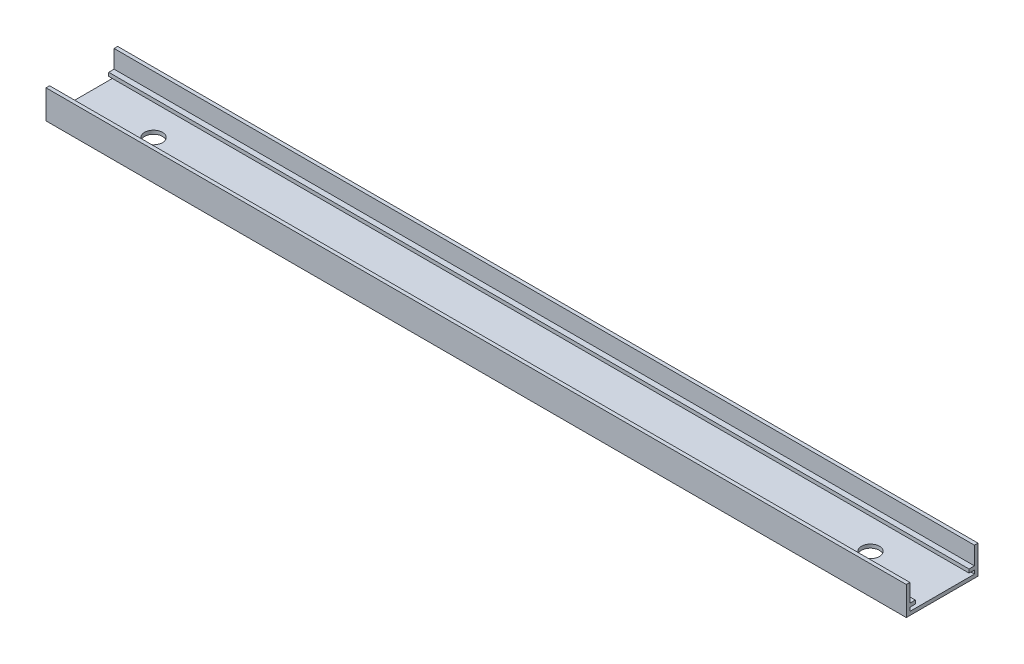
ISO-10303-21;
HEADER;
FILE_DESCRIPTION(('STEP AP214'),'2;1');
FILE_NAME('part.step','',(''),(''),'','','');
FILE_SCHEMA(('AUTOMOTIVE_DESIGN { 1 0 10303 214 1 1 1 1 }'));
ENDSEC;
DATA;
#1=APPLICATION_CONTEXT('core data for automotive mechanical design processes');
#2=APPLICATION_PROTOCOL_DEFINITION('international standard','automotive_design',2000,#1);
#3=PRODUCT_CONTEXT('',#1,'mechanical');
#4=PRODUCT('Part','Part','',(#3));
#5=PRODUCT_RELATED_PRODUCT_CATEGORY('part','',(#4));
#6=PRODUCT_DEFINITION_FORMATION('','',#4);
#7=PRODUCT_DEFINITION_CONTEXT('part definition',#1,'design');
#8=PRODUCT_DEFINITION('design','',#6,#7);
#9=PRODUCT_DEFINITION_SHAPE('','',#8);
#10=(LENGTH_UNIT() NAMED_UNIT(*) SI_UNIT(.MILLI.,.METRE.));
#11=(NAMED_UNIT(*) PLANE_ANGLE_UNIT() SI_UNIT($,.RADIAN.));
#12=(NAMED_UNIT(*) SI_UNIT($,.STERADIAN.) SOLID_ANGLE_UNIT());
#13=UNCERTAINTY_MEASURE_WITH_UNIT(LENGTH_MEASURE(1.E-05),#10,'distance_accuracy_value','');
#14=(GEOMETRIC_REPRESENTATION_CONTEXT(3) GLOBAL_UNCERTAINTY_ASSIGNED_CONTEXT((#13)) GLOBAL_UNIT_ASSIGNED_CONTEXT((#10,
#11,#12)) REPRESENTATION_CONTEXT('',''));
#15=CARTESIAN_POINT('',(0.,0.,0.));
#16=DIRECTION('',(0.,0.,1.));
#17=DIRECTION('',(1.,0.,0.));
#18=AXIS2_PLACEMENT_3D('',#15,#16,#17);
#19=CARTESIAN_POINT('',(-304.8,0.,0.));
#20=DIRECTION('',(0.,0.,1.));
#21=DIRECTION('',(1.,0.,0.));
#22=AXIS2_PLACEMENT_3D('',#19,#20,#21);
#23=PLANE('',#22);
#24=DIRECTION('',(0.,-1.,0.));
#25=VECTOR('',#24,1.);
#26=CARTESIAN_POINT('',(0.,0.,0.));
#27=LINE('',#26,#25);
#28=CARTESIAN_POINT('',(0.,10.16,0.));
#29=VERTEX_POINT('',#28);
#30=CARTESIAN_POINT('',(0.,0.,0.));
#31=VERTEX_POINT('',#30);
#32=EDGE_CURVE('E198',#29,#31,#27,.T.);
#33=ORIENTED_EDGE('',*,*,#32,.F.);
#34=DIRECTION('',(1.,0.,0.));
#35=VECTOR('',#34,1.);
#36=CARTESIAN_POINT('',(-304.8,10.16,0.));
#37=LINE('',#36,#35);
#38=CARTESIAN_POINT('',(-304.8,10.16,0.));
#39=VERTEX_POINT('',#38);
#40=EDGE_CURVE('E11',#39,#29,#37,.T.);
#41=ORIENTED_EDGE('',*,*,#40,.F.);
#42=DIRECTION('',(0.,-1.,0.));
#43=VECTOR('',#42,1.);
#44=CARTESIAN_POINT('',(-304.8,0.,0.));
#45=LINE('',#44,#43);
#46=CARTESIAN_POINT('',(-304.8,0.,0.));
#47=VERTEX_POINT('',#46);
#48=EDGE_CURVE('E260',#39,#47,#45,.T.);
#49=ORIENTED_EDGE('',*,*,#48,.T.);
#50=DIRECTION('',(1.,0.,0.));
#51=VECTOR('',#50,1.);
#52=CARTESIAN_POINT('',(-304.8,0.,0.));
#53=LINE('',#52,#51);
#54=EDGE_CURVE('E48',#47,#31,#53,.T.);
#55=ORIENTED_EDGE('',*,*,#54,.T.);
#56=EDGE_LOOP('',(#33,#41,#49,#55));
#57=FACE_BOUND('',#56,.T.);
#58=ADVANCED_FACE('F44',(#57),#23,.T.);
#59=CARTESIAN_POINT('',(-304.8,10.16,0.));
#60=DIRECTION('',(0.,1.,0.));
#61=DIRECTION('',(0.,0.,1.));
#62=AXIS2_PLACEMENT_3D('',#59,#60,#61);
#63=PLANE('',#62);
#64=DIRECTION('',(0.,0.,1.));
#65=VECTOR('',#64,1.);
#66=CARTESIAN_POINT('',(0.,10.16,0.));
#67=LINE('',#66,#65);
#68=CARTESIAN_POINT('',(0.,10.16,-1.27));
#69=VERTEX_POINT('',#68);
#70=EDGE_CURVE('E255',#69,#29,#67,.T.);
#71=ORIENTED_EDGE('',*,*,#70,.F.);
#72=DIRECTION('',(1.,0.,0.));
#73=VECTOR('',#72,1.);
#74=CARTESIAN_POINT('',(-304.8,10.16,-1.27));
#75=LINE('',#74,#73);
#76=CARTESIAN_POINT('',(-304.8,10.16,-1.27));
#77=VERTEX_POINT('',#76);
#78=EDGE_CURVE('E54',#77,#69,#75,.T.);
#79=ORIENTED_EDGE('',*,*,#78,.F.);
#80=DIRECTION('',(0.,0.,1.));
#81=VECTOR('',#80,1.);
#82=CARTESIAN_POINT('',(-304.8,10.16,0.));
#83=LINE('',#82,#81);
#84=EDGE_CURVE('E185',#77,#39,#83,.T.);
#85=ORIENTED_EDGE('',*,*,#84,.T.);
#86=ORIENTED_EDGE('',*,*,#40,.T.);
#87=EDGE_LOOP('',(#71,#79,#85,#86));
#88=FACE_BOUND('',#87,.T.);
#89=ADVANCED_FACE('F296',(#88),#63,.T.);
#90=CARTESIAN_POINT('',(-304.8,10.16,-1.27));
#91=DIRECTION('',(0.,0.,-1.));
#92=DIRECTION('',(0.,1.,0.));
#93=AXIS2_PLACEMENT_3D('',#90,#91,#92);
#94=PLANE('',#93);
#95=DIRECTION('',(0.,1.,0.));
#96=VECTOR('',#95,1.);
#97=CARTESIAN_POINT('',(0.,10.16,-1.27));
#98=LINE('',#97,#96);
#99=CARTESIAN_POINT('',(0.,3.81,-1.27));
#100=VERTEX_POINT('',#99);
#101=EDGE_CURVE('E169',#100,#69,#98,.T.);
#102=ORIENTED_EDGE('',*,*,#101,.F.);
#103=DIRECTION('',(1.,0.,0.));
#104=VECTOR('',#103,1.);
#105=CARTESIAN_POINT('',(-304.8,3.81,-1.27));
#106=LINE('',#105,#104);
#107=CARTESIAN_POINT('',(-304.8,3.81,-1.27));
#108=VERTEX_POINT('',#107);
#109=EDGE_CURVE('E162',#108,#100,#106,.T.);
#110=ORIENTED_EDGE('',*,*,#109,.F.);
#111=DIRECTION('',(0.,1.,0.));
#112=VECTOR('',#111,1.);
#113=CARTESIAN_POINT('',(-304.8,10.16,-1.27));
#114=LINE('',#113,#112);
#115=EDGE_CURVE('E167',#108,#77,#114,.T.);
#116=ORIENTED_EDGE('',*,*,#115,.T.);
#117=ORIENTED_EDGE('',*,*,#78,.T.);
#118=EDGE_LOOP('',(#102,#110,#116,#117));
#119=FACE_BOUND('',#118,.T.);
#120=ADVANCED_FACE('F164',(#119),#94,.T.);
#121=CARTESIAN_POINT('',(-304.8,3.81,-1.27));
#122=DIRECTION('',(0.,1.,0.));
#123=DIRECTION('',(0.,0.,1.));
#124=AXIS2_PLACEMENT_3D('',#121,#122,#123);
#125=PLANE('',#124);
#126=DIRECTION('',(0.,0.,1.));
#127=VECTOR('',#126,1.);
#128=CARTESIAN_POINT('',(0.,3.81,-1.27));
#129=LINE('',#128,#127);
#130=CARTESIAN_POINT('',(0.,3.81,-3.17589116415839));
#131=VERTEX_POINT('',#130);
#132=EDGE_CURVE('E250',#131,#100,#129,.T.);
#133=ORIENTED_EDGE('',*,*,#132,.F.);
#134=DIRECTION('',(1.,0.,0.));
#135=VECTOR('',#134,1.);
#136=CARTESIAN_POINT('',(-304.8,3.81,-3.17589116415839));
#137=LINE('',#136,#135);
#138=CARTESIAN_POINT('',(-304.8,3.81,-3.17589116415839));
#139=VERTEX_POINT('',#138);
#140=EDGE_CURVE('E171',#139,#131,#137,.T.);
#141=ORIENTED_EDGE('',*,*,#140,.F.);
#142=DIRECTION('',(0.,0.,1.));
#143=VECTOR('',#142,1.);
#144=CARTESIAN_POINT('',(-304.8,3.81,-1.27));
#145=LINE('',#144,#143);
#146=EDGE_CURVE('E176',#139,#108,#145,.T.);
#147=ORIENTED_EDGE('',*,*,#146,.T.);
#148=ORIENTED_EDGE('',*,*,#109,.T.);
#149=EDGE_LOOP('',(#133,#141,#147,#148));
#150=FACE_BOUND('',#149,.T.);
#151=ADVANCED_FACE('F183',(#150),#125,.T.);
#152=CARTESIAN_POINT('',(-304.8,3.81,-3.17589116415839));
#153=DIRECTION('',(0.,0.,-1.));
#154=DIRECTION('',(-1.,0.,0.));
#155=AXIS2_PLACEMENT_3D('',#152,#153,#154);
#156=PLANE('',#155);
#157=DIRECTION('',(0.,1.,0.));
#158=VECTOR('',#157,1.);
#159=CARTESIAN_POINT('',(0.,3.81,-3.17589116415839));
#160=LINE('',#159,#158);
#161=CARTESIAN_POINT('',(0.,2.54,-3.17589116415839));
#162=VERTEX_POINT('',#161);
#163=EDGE_CURVE('E243',#162,#131,#160,.T.);
#164=ORIENTED_EDGE('',*,*,#163,.F.);
#165=DIRECTION('',(1.,0.,0.));
#166=VECTOR('',#165,1.);
#167=CARTESIAN_POINT('',(-304.8,2.54,-3.17589116415839));
#168=LINE('',#167,#166);
#169=CARTESIAN_POINT('',(-304.8,2.54,-3.17589116415839));
#170=VERTEX_POINT('',#169);
#171=EDGE_CURVE('E263',#170,#162,#168,.T.);
#172=ORIENTED_EDGE('',*,*,#171,.F.);
#173=DIRECTION('',(0.,1.,0.));
#174=VECTOR('',#173,1.);
#175=CARTESIAN_POINT('',(-304.8,3.81,-3.17589116415839));
#176=LINE('',#175,#174);
#177=EDGE_CURVE('E190',#170,#139,#176,.T.);
#178=ORIENTED_EDGE('',*,*,#177,.T.);
#179=ORIENTED_EDGE('',*,*,#140,.T.);
#180=EDGE_LOOP('',(#164,#172,#178,#179));
#181=FACE_BOUND('',#180,.T.);
#182=ADVANCED_FACE('F315',(#181),#156,.T.);
#183=CARTESIAN_POINT('',(-304.8,2.54,-3.17589116415839));
#184=DIRECTION('',(0.,-1.,0.));
#185=DIRECTION('',(0.,0.,-1.));
#186=AXIS2_PLACEMENT_3D('',#183,#184,#185);
#187=PLANE('',#186);
#188=DIRECTION('',(0.,0.,-1.));
#189=VECTOR('',#188,1.);
#190=CARTESIAN_POINT('',(0.,2.54,-3.17589116415839));
#191=LINE('',#190,#189);
#192=CARTESIAN_POINT('',(0.,2.54,-1.27));
#193=VERTEX_POINT('',#192);
#194=EDGE_CURVE('E242',#193,#162,#191,.T.);
#195=ORIENTED_EDGE('',*,*,#194,.F.);
#196=DIRECTION('',(1.,0.,0.));
#197=VECTOR('',#196,1.);
#198=CARTESIAN_POINT('',(-304.8,2.54,-1.27));
#199=LINE('',#198,#197);
#200=CARTESIAN_POINT('',(-304.8,2.54,-1.27));
#201=VERTEX_POINT('',#200);
#202=EDGE_CURVE('E266',#201,#193,#199,.T.);
#203=ORIENTED_EDGE('',*,*,#202,.F.);
#204=DIRECTION('',(0.,0.,-1.));
#205=VECTOR('',#204,1.);
#206=CARTESIAN_POINT('',(-304.8,2.54,-3.17589116415839));
#207=LINE('',#206,#205);
#208=EDGE_CURVE('E188',#201,#170,#207,.T.);
#209=ORIENTED_EDGE('',*,*,#208,.T.);
#210=ORIENTED_EDGE('',*,*,#171,.T.);
#211=EDGE_LOOP('',(#195,#203,#209,#210));
#212=FACE_BOUND('',#211,.T.);
#213=ADVANCED_FACE('F312',(#212),#187,.T.);
#214=CARTESIAN_POINT('',(-304.8,2.54,-1.27));
#215=DIRECTION('',(0.,0.,-1.));
#216=DIRECTION('',(0.,1.,0.));
#217=AXIS2_PLACEMENT_3D('',#214,#215,#216);
#218=PLANE('',#217);
#219=DIRECTION('',(0.,1.,0.));
#220=VECTOR('',#219,1.);
#221=CARTESIAN_POINT('',(0.,2.54,-1.27));
#222=LINE('',#221,#220);
#223=CARTESIAN_POINT('',(0.,1.27,-1.27));
#224=VERTEX_POINT('',#223);
#225=EDGE_CURVE('E240',#224,#193,#222,.T.);
#226=ORIENTED_EDGE('',*,*,#225,.F.);
#227=DIRECTION('',(1.,0.,0.));
#228=VECTOR('',#227,1.);
#229=CARTESIAN_POINT('',(-304.8,1.27,-1.27));
#230=LINE('',#229,#228);
#231=CARTESIAN_POINT('',(-304.8,1.27,-1.27));
#232=VERTEX_POINT('',#231);
#233=EDGE_CURVE('E267',#232,#224,#230,.T.);
#234=ORIENTED_EDGE('',*,*,#233,.F.);
#235=DIRECTION('',(0.,1.,0.));
#236=VECTOR('',#235,1.);
#237=CARTESIAN_POINT('',(-304.8,2.54,-1.27));
#238=LINE('',#237,#236);
#239=EDGE_CURVE('E415',#232,#201,#238,.T.);
#240=ORIENTED_EDGE('',*,*,#239,.T.);
#241=ORIENTED_EDGE('',*,*,#202,.T.);
#242=EDGE_LOOP('',(#226,#234,#240,#241));
#243=FACE_BOUND('',#242,.T.);
#244=ADVANCED_FACE('F317',(#243),#218,.T.);
#245=CARTESIAN_POINT('',(-304.8,1.27,-1.27));
#246=DIRECTION('',(0.,1.,0.));
#247=DIRECTION('',(0.,0.,1.));
#248=AXIS2_PLACEMENT_3D('',#245,#246,#247);
#249=PLANE('',#248);
#250=CARTESIAN_POINT('',(-279.4,1.27,-12.7));
#251=DIRECTION('',(0.,1.,0.));
#252=DIRECTION('',(0.,0.,1.));
#253=AXIS2_PLACEMENT_3D('',#250,#251,#252);
#254=CIRCLE('',#253,3.17499999999997);
#255=CARTESIAN_POINT('',(-279.4,1.27,-9.52500000000003));
#256=VERTEX_POINT('',#255);
#257=EDGE_CURVE('E373',#256,#256,#254,.T.);
#258=ORIENTED_EDGE('',*,*,#257,.F.);
#259=EDGE_LOOP('',(#258));
#260=FACE_BOUND('',#259,.T.);
#261=CARTESIAN_POINT('',(-25.4000000000001,1.27,-12.7));
#262=DIRECTION('',(0.,1.,0.));
#263=DIRECTION('',(0.,0.,-1.));
#264=AXIS2_PLACEMENT_3D('',#261,#262,#263);
#265=CIRCLE('',#264,3.17499999999997);
#266=CARTESIAN_POINT('',(-25.4000000000001,1.27,-15.875));
#267=VERTEX_POINT('',#266);
#268=EDGE_CURVE('E369',#267,#267,#265,.T.);
#269=ORIENTED_EDGE('',*,*,#268,.F.);
#270=EDGE_LOOP('',(#269));
#271=FACE_BOUND('',#270,.T.);
#272=DIRECTION('',(0.,0.,1.));
#273=VECTOR('',#272,1.);
#274=CARTESIAN_POINT('',(0.,1.27,-1.27));
#275=LINE('',#274,#273);
#276=CARTESIAN_POINT('',(0.,1.27,-24.13));
#277=VERTEX_POINT('',#276);
#278=EDGE_CURVE('E232',#277,#224,#275,.T.);
#279=ORIENTED_EDGE('',*,*,#278,.F.);
#280=DIRECTION('',(1.,0.,0.));
#281=VECTOR('',#280,1.);
#282=CARTESIAN_POINT('',(-304.8,1.27,-24.13));
#283=LINE('',#282,#281);
#284=CARTESIAN_POINT('',(-304.8,1.27,-24.13));
#285=VERTEX_POINT('',#284);
#286=EDGE_CURVE('E275',#285,#277,#283,.T.);
#287=ORIENTED_EDGE('',*,*,#286,.F.);
#288=DIRECTION('',(0.,0.,1.));
#289=VECTOR('',#288,1.);
#290=CARTESIAN_POINT('',(-304.8,1.27,-1.27));
#291=LINE('',#290,#289);
#292=EDGE_CURVE('E408',#285,#232,#291,.T.);
#293=ORIENTED_EDGE('',*,*,#292,.T.);
#294=ORIENTED_EDGE('',*,*,#233,.T.);
#295=EDGE_LOOP('',(#279,#287,#293,#294));
#296=FACE_BOUND('',#295,.T.);
#297=ADVANCED_FACE('F323',(#260,#271,#296),#249,.T.);
#298=CARTESIAN_POINT('',(-304.8,2.54,-24.13));
#299=DIRECTION('',(0.,0.,1.));
#300=DIRECTION('',(1.,0.,0.));
#301=AXIS2_PLACEMENT_3D('',#298,#299,#300);
#302=PLANE('',#301);
#303=DIRECTION('',(0.,-1.,0.));
#304=VECTOR('',#303,1.);
#305=CARTESIAN_POINT('',(0.,2.54,-24.13));
#306=LINE('',#305,#304);
#307=CARTESIAN_POINT('',(0.,2.54,-24.13));
#308=VERTEX_POINT('',#307);
#309=EDGE_CURVE('E226',#308,#277,#306,.T.);
#310=ORIENTED_EDGE('',*,*,#309,.F.);
#311=DIRECTION('',(1.,0.,0.));
#312=VECTOR('',#311,1.);
#313=CARTESIAN_POINT('',(-304.8,2.54,-24.13));
#314=LINE('',#313,#312);
#315=CARTESIAN_POINT('',(-304.8,2.54,-24.13));
#316=VERTEX_POINT('',#315);
#317=EDGE_CURVE('E274',#316,#308,#314,.T.);
#318=ORIENTED_EDGE('',*,*,#317,.F.);
#319=DIRECTION('',(0.,-1.,0.));
#320=VECTOR('',#319,1.);
#321=CARTESIAN_POINT('',(-304.8,2.54,-24.13));
#322=LINE('',#321,#320);
#323=EDGE_CURVE('E407',#316,#285,#322,.T.);
#324=ORIENTED_EDGE('',*,*,#323,.T.);
#325=ORIENTED_EDGE('',*,*,#286,.T.);
#326=EDGE_LOOP('',(#310,#318,#324,#325));
#327=FACE_BOUND('',#326,.T.);
#328=ADVANCED_FACE('F330',(#327),#302,.T.);
#329=CARTESIAN_POINT('',(-304.8,2.54,-22.2241088358416));
#330=DIRECTION('',(0.,-1.,0.));
#331=DIRECTION('',(0.,0.,-1.));
#332=AXIS2_PLACEMENT_3D('',#329,#330,#331);
#333=PLANE('',#332);
#334=DIRECTION('',(0.,0.,-1.));
#335=VECTOR('',#334,1.);
#336=CARTESIAN_POINT('',(0.,2.54,-22.2241088358416));
#337=LINE('',#336,#335);
#338=CARTESIAN_POINT('',(0.,2.54,-22.2241088358416));
#339=VERTEX_POINT('',#338);
#340=EDGE_CURVE('E223',#339,#308,#337,.T.);
#341=ORIENTED_EDGE('',*,*,#340,.F.);
#342=DIRECTION('',(1.,0.,0.));
#343=VECTOR('',#342,1.);
#344=CARTESIAN_POINT('',(-304.8,2.54,-22.2241088358416));
#345=LINE('',#344,#343);
#346=CARTESIAN_POINT('',(-304.8,2.54,-22.2241088358416));
#347=VERTEX_POINT('',#346);
#348=EDGE_CURVE('E279',#347,#339,#345,.T.);
#349=ORIENTED_EDGE('',*,*,#348,.F.);
#350=DIRECTION('',(0.,0.,-1.));
#351=VECTOR('',#350,1.);
#352=CARTESIAN_POINT('',(-304.8,2.54,-22.2241088358416));
#353=LINE('',#352,#351);
#354=EDGE_CURVE('E405',#347,#316,#353,.T.);
#355=ORIENTED_EDGE('',*,*,#354,.T.);
#356=ORIENTED_EDGE('',*,*,#317,.T.);
#357=EDGE_LOOP('',(#341,#349,#355,#356));
#358=FACE_BOUND('',#357,.T.);
#359=ADVANCED_FACE('F332',(#358),#333,.T.);
#360=CARTESIAN_POINT('',(-304.8,3.81,-22.2241088358416));
#361=DIRECTION('',(0.,0.,1.));
#362=DIRECTION('',(1.,0.,0.));
#363=AXIS2_PLACEMENT_3D('',#360,#361,#362);
#364=PLANE('',#363);
#365=DIRECTION('',(0.,-1.,0.));
#366=VECTOR('',#365,1.);
#367=CARTESIAN_POINT('',(0.,3.81,-22.2241088358416));
#368=LINE('',#367,#366);
#369=CARTESIAN_POINT('',(0.,3.81,-22.2241088358416));
#370=VERTEX_POINT('',#369);
#371=EDGE_CURVE('E222',#370,#339,#368,.T.);
#372=ORIENTED_EDGE('',*,*,#371,.F.);
#373=DIRECTION('',(1.,0.,0.));
#374=VECTOR('',#373,1.);
#375=CARTESIAN_POINT('',(-304.8,3.81,-22.2241088358416));
#376=LINE('',#375,#374);
#377=CARTESIAN_POINT('',(-304.8,3.81,-22.2241088358416));
#378=VERTEX_POINT('',#377);
#379=EDGE_CURVE('E282',#378,#370,#376,.T.);
#380=ORIENTED_EDGE('',*,*,#379,.F.);
#381=DIRECTION('',(0.,-1.,0.));
#382=VECTOR('',#381,1.);
#383=CARTESIAN_POINT('',(-304.8,3.81,-22.2241088358416));
#384=LINE('',#383,#382);
#385=EDGE_CURVE('E397',#378,#347,#384,.T.);
#386=ORIENTED_EDGE('',*,*,#385,.T.);
#387=ORIENTED_EDGE('',*,*,#348,.T.);
#388=EDGE_LOOP('',(#372,#380,#386,#387));
#389=FACE_BOUND('',#388,.T.);
#390=ADVANCED_FACE('F333',(#389),#364,.T.);
#391=CARTESIAN_POINT('',(-304.8,3.81,-24.13));
#392=DIRECTION('',(0.,1.,0.));
#393=DIRECTION('',(0.,0.,1.));
#394=AXIS2_PLACEMENT_3D('',#391,#392,#393);
#395=PLANE('',#394);
#396=DIRECTION('',(0.,0.,1.));
#397=VECTOR('',#396,1.);
#398=CARTESIAN_POINT('',(0.,3.81,-24.13));
#399=LINE('',#398,#397);
#400=CARTESIAN_POINT('',(0.,3.81,-24.13));
#401=VERTEX_POINT('',#400);
#402=EDGE_CURVE('E220',#401,#370,#399,.T.);
#403=ORIENTED_EDGE('',*,*,#402,.F.);
#404=DIRECTION('',(1.,0.,0.));
#405=VECTOR('',#404,1.);
#406=CARTESIAN_POINT('',(-304.8,3.81,-24.13));
#407=LINE('',#406,#405);
#408=CARTESIAN_POINT('',(-304.8,3.81,-24.13));
#409=VERTEX_POINT('',#408);
#410=EDGE_CURVE('E281',#409,#401,#407,.T.);
#411=ORIENTED_EDGE('',*,*,#410,.F.);
#412=DIRECTION('',(0.,0.,1.));
#413=VECTOR('',#412,1.);
#414=CARTESIAN_POINT('',(-304.8,3.81,-24.13));
#415=LINE('',#414,#413);
#416=EDGE_CURVE('E391',#409,#378,#415,.T.);
#417=ORIENTED_EDGE('',*,*,#416,.T.);
#418=ORIENTED_EDGE('',*,*,#379,.T.);
#419=EDGE_LOOP('',(#403,#411,#417,#418));
#420=FACE_BOUND('',#419,.T.);
#421=ADVANCED_FACE('F336',(#420),#395,.T.);
#422=CARTESIAN_POINT('',(-304.8,10.16,-24.13));
#423=DIRECTION('',(0.,0.,1.));
#424=DIRECTION('',(1.,0.,0.));
#425=AXIS2_PLACEMENT_3D('',#422,#423,#424);
#426=PLANE('',#425);
#427=DIRECTION('',(0.,-1.,0.));
#428=VECTOR('',#427,1.);
#429=CARTESIAN_POINT('',(0.,10.16,-24.13));
#430=LINE('',#429,#428);
#431=CARTESIAN_POINT('',(0.,10.16,-24.13));
#432=VERTEX_POINT('',#431);
#433=EDGE_CURVE('E213',#432,#401,#430,.T.);
#434=ORIENTED_EDGE('',*,*,#433,.F.);
#435=DIRECTION('',(1.,0.,0.));
#436=VECTOR('',#435,1.);
#437=CARTESIAN_POINT('',(-304.8,10.16,-24.13));
#438=LINE('',#437,#436);
#439=CARTESIAN_POINT('',(-304.8,10.16,-24.13));
#440=VERTEX_POINT('',#439);
#441=EDGE_CURVE('E289',#440,#432,#438,.T.);
#442=ORIENTED_EDGE('',*,*,#441,.F.);
#443=DIRECTION('',(0.,-1.,0.));
#444=VECTOR('',#443,1.);
#445=CARTESIAN_POINT('',(-304.8,10.16,-24.13));
#446=LINE('',#445,#444);
#447=EDGE_CURVE('E388',#440,#409,#446,.T.);
#448=ORIENTED_EDGE('',*,*,#447,.T.);
#449=ORIENTED_EDGE('',*,*,#410,.T.);
#450=EDGE_LOOP('',(#434,#442,#448,#449));
#451=FACE_BOUND('',#450,.T.);
#452=ADVANCED_FACE('F342',(#451),#426,.T.);
#453=CARTESIAN_POINT('',(-304.8,10.16,-25.4));
#454=DIRECTION('',(0.,1.,0.));
#455=DIRECTION('',(0.,0.,1.));
#456=AXIS2_PLACEMENT_3D('',#453,#454,#455);
#457=PLANE('',#456);
#458=DIRECTION('',(0.,0.,1.));
#459=VECTOR('',#458,1.);
#460=CARTESIAN_POINT('',(0.,10.16,-25.4));
#461=LINE('',#460,#459);
#462=CARTESIAN_POINT('',(0.,10.16,-25.4));
#463=VERTEX_POINT('',#462);
#464=EDGE_CURVE('E207',#463,#432,#461,.T.);
#465=ORIENTED_EDGE('',*,*,#464,.F.);
#466=DIRECTION('',(1.,0.,0.));
#467=VECTOR('',#466,1.);
#468=CARTESIAN_POINT('',(-304.8,10.16,-25.4));
#469=LINE('',#468,#467);
#470=CARTESIAN_POINT('',(-304.8,10.16,-25.4));
#471=VERTEX_POINT('',#470);
#472=EDGE_CURVE('E286',#471,#463,#469,.T.);
#473=ORIENTED_EDGE('',*,*,#472,.F.);
#474=DIRECTION('',(0.,0.,1.));
#475=VECTOR('',#474,1.);
#476=CARTESIAN_POINT('',(-304.8,10.16,-25.4));
#477=LINE('',#476,#475);
#478=EDGE_CURVE('E387',#471,#440,#477,.T.);
#479=ORIENTED_EDGE('',*,*,#478,.T.);
#480=ORIENTED_EDGE('',*,*,#441,.T.);
#481=EDGE_LOOP('',(#465,#473,#479,#480));
#482=FACE_BOUND('',#481,.T.);
#483=ADVANCED_FACE('F350',(#482),#457,.T.);
#484=CARTESIAN_POINT('',(-304.8,0.,-25.4));
#485=DIRECTION('',(0.,0.,-1.));
#486=DIRECTION('',(-1.,0.,0.));
#487=AXIS2_PLACEMENT_3D('',#484,#485,#486);
#488=PLANE('',#487);
#489=DIRECTION('',(0.,1.,0.));
#490=VECTOR('',#489,1.);
#491=CARTESIAN_POINT('',(0.,0.,-25.4));
#492=LINE('',#491,#490);
#493=CARTESIAN_POINT('',(0.,0.,-25.4));
#494=VERTEX_POINT('',#493);
#495=EDGE_CURVE('E202',#494,#463,#492,.T.);
#496=ORIENTED_EDGE('',*,*,#495,.F.);
#497=DIRECTION('',(1.,0.,0.));
#498=VECTOR('',#497,1.);
#499=CARTESIAN_POINT('',(-304.8,0.,-25.4));
#500=LINE('',#499,#498);
#501=CARTESIAN_POINT('',(-304.8,0.,-25.4));
#502=VERTEX_POINT('',#501);
#503=EDGE_CURVE('E295',#502,#494,#500,.T.);
#504=ORIENTED_EDGE('',*,*,#503,.F.);
#505=DIRECTION('',(0.,1.,0.));
#506=VECTOR('',#505,1.);
#507=CARTESIAN_POINT('',(-304.8,0.,-25.4));
#508=LINE('',#507,#506);
#509=EDGE_CURVE('E385',#502,#471,#508,.T.);
#510=ORIENTED_EDGE('',*,*,#509,.T.);
#511=ORIENTED_EDGE('',*,*,#472,.T.);
#512=EDGE_LOOP('',(#496,#504,#510,#511));
#513=FACE_BOUND('',#512,.T.);
#514=ADVANCED_FACE('F352',(#513),#488,.T.);
#515=CARTESIAN_POINT('',(-304.8,0.,0.));
#516=DIRECTION('',(0.,-1.,0.));
#517=DIRECTION('',(0.,0.,-1.));
#518=AXIS2_PLACEMENT_3D('',#515,#516,#517);
#519=PLANE('',#518);
#520=CARTESIAN_POINT('',(-279.4,0.,-12.7));
#521=DIRECTION('',(0.,1.,0.));
#522=DIRECTION('',(0.,0.,1.));
#523=AXIS2_PLACEMENT_3D('',#520,#521,#522);
#524=CIRCLE('',#523,3.17499999999997);
#525=CARTESIAN_POINT('',(-279.4,0.,-9.52500000000003));
#526=VERTEX_POINT('',#525);
#527=EDGE_CURVE('E203',#526,#526,#524,.T.);
#528=ORIENTED_EDGE('',*,*,#527,.T.);
#529=EDGE_LOOP('',(#528));
#530=FACE_BOUND('',#529,.T.);
#531=CARTESIAN_POINT('',(-25.4000000000001,0.,-12.7));
#532=DIRECTION('',(0.,1.,0.));
#533=DIRECTION('',(0.,0.,-1.));
#534=AXIS2_PLACEMENT_3D('',#531,#532,#533);
#535=CIRCLE('',#534,3.17499999999997);
#536=CARTESIAN_POINT('',(-25.4000000000001,0.,-15.875));
#537=VERTEX_POINT('',#536);
#538=EDGE_CURVE('E368',#537,#537,#535,.T.);
#539=ORIENTED_EDGE('',*,*,#538,.T.);
#540=EDGE_LOOP('',(#539));
#541=FACE_BOUND('',#540,.T.);
#542=DIRECTION('',(0.,0.,-1.));
#543=VECTOR('',#542,1.);
#544=CARTESIAN_POINT('',(0.,0.,0.));
#545=LINE('',#544,#543);
#546=EDGE_CURVE('E199',#31,#494,#545,.T.);
#547=ORIENTED_EDGE('',*,*,#546,.F.);
#548=ORIENTED_EDGE('',*,*,#54,.F.);
#549=DIRECTION('',(0.,0.,-1.));
#550=VECTOR('',#549,1.);
#551=CARTESIAN_POINT('',(-304.8,0.,0.));
#552=LINE('',#551,#550);
#553=EDGE_CURVE('E377',#47,#502,#552,.T.);
#554=ORIENTED_EDGE('',*,*,#553,.T.);
#555=ORIENTED_EDGE('',*,*,#503,.T.);
#556=EDGE_LOOP('',(#547,#548,#554,#555));
#557=FACE_BOUND('',#556,.T.);
#558=ADVANCED_FACE('F297',(#530,#541,#557),#519,.T.);
#559=CARTESIAN_POINT('',(-304.8,0.,0.));
#560=DIRECTION('',(-1.,0.,0.));
#561=DIRECTION('',(0.,0.,1.));
#562=AXIS2_PLACEMENT_3D('',#559,#560,#561);
#563=PLANE('',#562);
#564=ORIENTED_EDGE('',*,*,#48,.F.);
#565=ORIENTED_EDGE('',*,*,#84,.F.);
#566=ORIENTED_EDGE('',*,*,#115,.F.);
#567=ORIENTED_EDGE('',*,*,#146,.F.);
#568=ORIENTED_EDGE('',*,*,#177,.F.);
#569=ORIENTED_EDGE('',*,*,#208,.F.);
#570=ORIENTED_EDGE('',*,*,#239,.F.);
#571=ORIENTED_EDGE('',*,*,#292,.F.);
#572=ORIENTED_EDGE('',*,*,#323,.F.);
#573=ORIENTED_EDGE('',*,*,#354,.F.);
#574=ORIENTED_EDGE('',*,*,#385,.F.);
#575=ORIENTED_EDGE('',*,*,#416,.F.);
#576=ORIENTED_EDGE('',*,*,#447,.F.);
#577=ORIENTED_EDGE('',*,*,#478,.F.);
#578=ORIENTED_EDGE('',*,*,#509,.F.);
#579=ORIENTED_EDGE('',*,*,#553,.F.);
#580=EDGE_LOOP('',(#564,#565,#566,#567,#568,#569,#570,#571,#572,#573,#574,#575,#576,#577,#578,#579));
#581=FACE_BOUND('',#580,.T.);
#582=ADVANCED_FACE('F177',(#581),#563,.T.);
#583=CARTESIAN_POINT('',(0.,0.,0.));
#584=DIRECTION('',(-1.,0.,0.));
#585=DIRECTION('',(0.,0.,1.));
#586=AXIS2_PLACEMENT_3D('',#583,#584,#585);
#587=PLANE('',#586);
#588=ORIENTED_EDGE('',*,*,#32,.T.);
#589=ORIENTED_EDGE('',*,*,#546,.T.);
#590=ORIENTED_EDGE('',*,*,#495,.T.);
#591=ORIENTED_EDGE('',*,*,#464,.T.);
#592=ORIENTED_EDGE('',*,*,#433,.T.);
#593=ORIENTED_EDGE('',*,*,#402,.T.);
#594=ORIENTED_EDGE('',*,*,#371,.T.);
#595=ORIENTED_EDGE('',*,*,#340,.T.);
#596=ORIENTED_EDGE('',*,*,#309,.T.);
#597=ORIENTED_EDGE('',*,*,#278,.T.);
#598=ORIENTED_EDGE('',*,*,#225,.T.);
#599=ORIENTED_EDGE('',*,*,#194,.T.);
#600=ORIENTED_EDGE('',*,*,#163,.T.);
#601=ORIENTED_EDGE('',*,*,#132,.T.);
#602=ORIENTED_EDGE('',*,*,#101,.T.);
#603=ORIENTED_EDGE('',*,*,#70,.T.);
#604=EDGE_LOOP('',(#588,#589,#590,#591,#592,#593,#594,#595,#596,#597,#598,#599,#600,#601,#602,#603));
#605=FACE_BOUND('',#604,.T.);
#606=ADVANCED_FACE('F299',(#605),#587,.F.);
#607=CARTESIAN_POINT('',(-25.4000000000001,0.,-12.7));
#608=DIRECTION('',(0.,1.,0.));
#609=DIRECTION('',(0.,0.,1.));
#610=AXIS2_PLACEMENT_3D('',#607,#608,#609);
#611=CYLINDRICAL_SURFACE('',#610,3.17499999999997);
#612=ORIENTED_EDGE('',*,*,#538,.F.);
#613=EDGE_LOOP('',(#612));
#614=FACE_BOUND('',#613,.T.);
#615=ORIENTED_EDGE('',*,*,#268,.T.);
#616=EDGE_LOOP('',(#615));
#617=FACE_BOUND('',#616,.T.);
#618=ADVANCED_FACE('F448',(#614,#617),#611,.F.);
#619=CARTESIAN_POINT('',(-279.4,0.,-12.7));
#620=DIRECTION('',(0.,1.,0.));
#621=DIRECTION('',(0.,0.,1.));
#622=AXIS2_PLACEMENT_3D('',#619,#620,#621);
#623=CYLINDRICAL_SURFACE('',#622,3.17499999999997);
#624=ORIENTED_EDGE('',*,*,#527,.F.);
#625=EDGE_LOOP('',(#624));
#626=FACE_BOUND('',#625,.T.);
#627=ORIENTED_EDGE('',*,*,#257,.T.);
#628=EDGE_LOOP('',(#627));
#629=FACE_BOUND('',#628,.T.);
#630=ADVANCED_FACE('F447',(#626,#629),#623,.F.);
#631=CLOSED_SHELL('',(#58,#89,#120,#151,#182,#213,#244,#297,#328,#359,#390,#421,#452,#483,#514,
#558,#582,#606,#618,#630));
#632=MANIFOLD_SOLID_BREP('B2',#631);
#633=ADVANCED_BREP_SHAPE_REPRESENTATION('',(#18,#632),#14);
#634=SHAPE_DEFINITION_REPRESENTATION(#9,#633);
ENDSEC;
END-ISO-10303-21;
